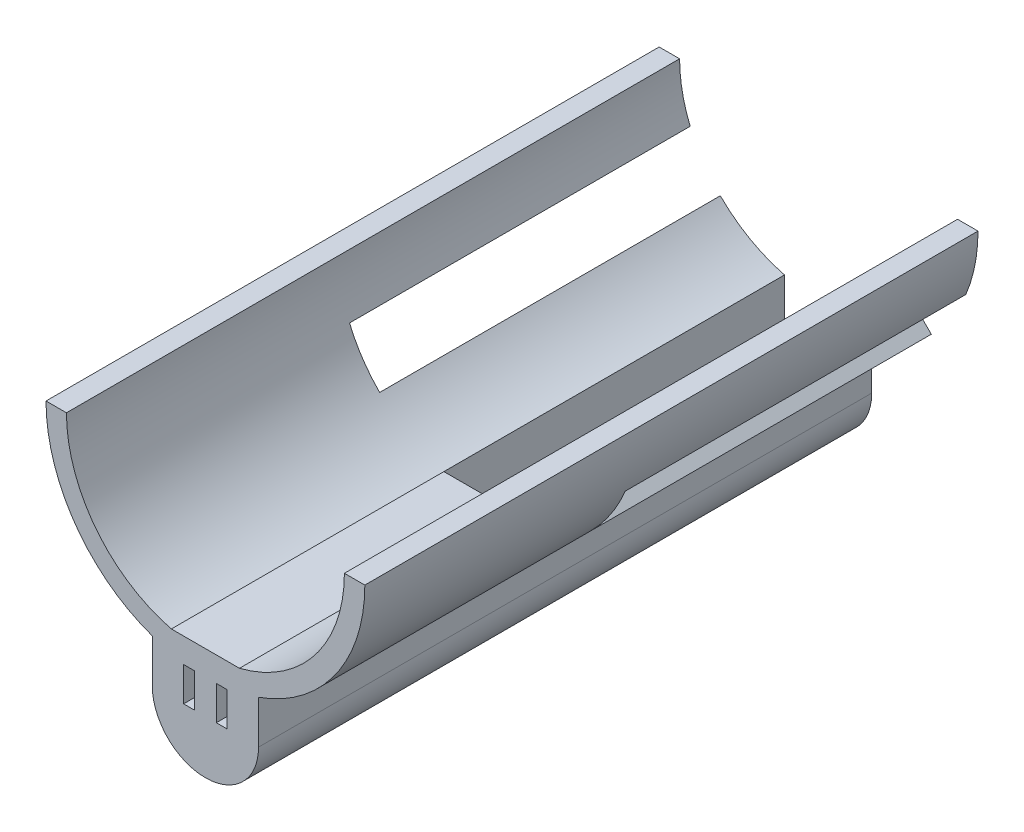
ISO-10303-21;
HEADER;
FILE_DESCRIPTION(('STEP AP214'),'2;1');
FILE_NAME('part.step','',(''),(''),'','','');
FILE_SCHEMA(('AUTOMOTIVE_DESIGN { 1 0 10303 214 1 1 1 1 }'));
ENDSEC;
DATA;
#1=APPLICATION_CONTEXT('core data for automotive mechanical design processes');
#2=APPLICATION_PROTOCOL_DEFINITION('international standard','automotive_design',2000,#1);
#3=PRODUCT_CONTEXT('',#1,'mechanical');
#4=PRODUCT('Part','Part','',(#3));
#5=PRODUCT_RELATED_PRODUCT_CATEGORY('part','',(#4));
#6=PRODUCT_DEFINITION_FORMATION('','',#4);
#7=PRODUCT_DEFINITION_CONTEXT('part definition',#1,'design');
#8=PRODUCT_DEFINITION('design','',#6,#7);
#9=PRODUCT_DEFINITION_SHAPE('','',#8);
#10=(LENGTH_UNIT() NAMED_UNIT(*) SI_UNIT(.MILLI.,.METRE.));
#11=(NAMED_UNIT(*) PLANE_ANGLE_UNIT() SI_UNIT($,.RADIAN.));
#12=(NAMED_UNIT(*) SI_UNIT($,.STERADIAN.) SOLID_ANGLE_UNIT());
#13=UNCERTAINTY_MEASURE_WITH_UNIT(LENGTH_MEASURE(1.E-05),#10,'distance_accuracy_value','');
#14=(GEOMETRIC_REPRESENTATION_CONTEXT(3) GLOBAL_UNCERTAINTY_ASSIGNED_CONTEXT((#13)) GLOBAL_UNIT_ASSIGNED_CONTEXT((#10,
#11,#12)) REPRESENTATION_CONTEXT('',''));
#15=CARTESIAN_POINT('',(0.,0.,0.));
#16=DIRECTION('',(0.,0.,1.));
#17=DIRECTION('',(1.,0.,0.));
#18=AXIS2_PLACEMENT_3D('',#15,#16,#17);
#19=CARTESIAN_POINT('',(5.00000000000001,0.,40.));
#20=DIRECTION('',(-1.,0.,0.));
#21=DIRECTION('',(0.,-1.,0.));
#22=AXIS2_PLACEMENT_3D('',#19,#20,#21);
#23=PLANE('',#22);
#24=DIRECTION('',(0.,-1.,0.));
#25=VECTOR('',#24,1.);
#26=CARTESIAN_POINT('',(5.00000000000001,0.,37.));
#27=LINE('',#26,#25);
#28=CARTESIAN_POINT('',(5.,-22.7777652933793,37.));
#29=VERTEX_POINT('',#28);
#30=CARTESIAN_POINT('',(5.,-28.4,37.));
#31=VERTEX_POINT('',#30);
#32=EDGE_CURVE('E306',#29,#31,#27,.T.);
#33=ORIENTED_EDGE('',*,*,#32,.F.);
#34=DIRECTION('',(0.,0.,1.));
#35=VECTOR('',#34,1.);
#36=CARTESIAN_POINT('',(5.,-22.7777652933793,0.));
#37=LINE('',#36,#35);
#38=CARTESIAN_POINT('',(5.,-22.7777652933793,0.));
#39=VERTEX_POINT('',#38);
#40=EDGE_CURVE('E65',#39,#29,#37,.T.);
#41=ORIENTED_EDGE('',*,*,#40,.F.);
#42=DIRECTION('',(0.,-1.,0.));
#43=VECTOR('',#42,1.);
#44=CARTESIAN_POINT('',(5.,-19.7777652933793,0.));
#45=LINE('',#44,#43);
#46=CARTESIAN_POINT('',(5.,-19.7777652933793,0.));
#47=VERTEX_POINT('',#46);
#48=EDGE_CURVE('E601',#47,#39,#45,.T.);
#49=ORIENTED_EDGE('',*,*,#48,.F.);
#50=DIRECTION('',(0.,0.,-1.));
#51=VECTOR('',#50,1.);
#52=CARTESIAN_POINT('',(5.,-19.7777652933793,40.));
#53=LINE('',#52,#51);
#54=CARTESIAN_POINT('',(5.,-19.7777652933793,-50.));
#55=VERTEX_POINT('',#54);
#56=EDGE_CURVE('E551',#47,#55,#53,.T.);
#57=ORIENTED_EDGE('',*,*,#56,.T.);
#58=DIRECTION('',(0.,1.,0.));
#59=VECTOR('',#58,1.);
#60=CARTESIAN_POINT('',(5.00000000000001,0.,-50.));
#61=LINE('',#60,#59);
#62=CARTESIAN_POINT('',(5.,-28.4,-50.));
#63=VERTEX_POINT('',#62);
#64=EDGE_CURVE('E428',#63,#55,#61,.T.);
#65=ORIENTED_EDGE('',*,*,#64,.F.);
#66=DIRECTION('',(0.,0.,-1.));
#67=VECTOR('',#66,1.);
#68=CARTESIAN_POINT('',(5.,-28.4,40.));
#69=LINE('',#68,#67);
#70=EDGE_CURVE('E548',#31,#63,#69,.T.);
#71=ORIENTED_EDGE('',*,*,#70,.F.);
#72=EDGE_LOOP('',(#33,#41,#49,#57,#65,#71));
#73=FACE_BOUND('',#72,.T.);
#74=ADVANCED_FACE('F49',(#73),#23,.T.);
#75=CARTESIAN_POINT('',(-5.,0.,40.));
#76=DIRECTION('',(-1.,0.,0.));
#77=DIRECTION('',(0.,-1.,0.));
#78=AXIS2_PLACEMENT_3D('',#75,#76,#77);
#79=PLANE('',#78);
#80=DIRECTION('',(0.,0.,1.));
#81=VECTOR('',#80,1.);
#82=CARTESIAN_POINT('',(-5.,-22.7777652933793,0.));
#83=LINE('',#82,#81);
#84=CARTESIAN_POINT('',(-5.,-22.7777652933793,0.));
#85=VERTEX_POINT('',#84);
#86=CARTESIAN_POINT('',(-5.,-22.7777652933793,37.));
#87=VERTEX_POINT('',#86);
#88=EDGE_CURVE('E617',#85,#87,#83,.T.);
#89=ORIENTED_EDGE('',*,*,#88,.T.);
#90=DIRECTION('',(0.,1.,0.));
#91=VECTOR('',#90,1.);
#92=CARTESIAN_POINT('',(-5.,0.,37.));
#93=LINE('',#92,#91);
#94=CARTESIAN_POINT('',(-5.,-28.4,37.));
#95=VERTEX_POINT('',#94);
#96=EDGE_CURVE('E299',#95,#87,#93,.T.);
#97=ORIENTED_EDGE('',*,*,#96,.F.);
#98=DIRECTION('',(0.,0.,-1.));
#99=VECTOR('',#98,1.);
#100=CARTESIAN_POINT('',(-5.,-28.4,40.));
#101=LINE('',#100,#99);
#102=CARTESIAN_POINT('',(-5.,-28.4,-50.));
#103=VERTEX_POINT('',#102);
#104=EDGE_CURVE('E545',#95,#103,#101,.T.);
#105=ORIENTED_EDGE('',*,*,#104,.T.);
#106=DIRECTION('',(0.,1.,0.));
#107=VECTOR('',#106,1.);
#108=CARTESIAN_POINT('',(-5.,0.,-50.));
#109=LINE('',#108,#107);
#110=CARTESIAN_POINT('',(-5.,-19.7777652933793,-50.));
#111=VERTEX_POINT('',#110);
#112=EDGE_CURVE('E437',#103,#111,#109,.T.);
#113=ORIENTED_EDGE('',*,*,#112,.T.);
#114=DIRECTION('',(0.,0.,-1.));
#115=VECTOR('',#114,1.);
#116=CARTESIAN_POINT('',(-5.,-19.7777652933793,40.));
#117=LINE('',#116,#115);
#118=CARTESIAN_POINT('',(-5.,-19.7777652933793,0.));
#119=VERTEX_POINT('',#118);
#120=EDGE_CURVE('E541',#119,#111,#117,.T.);
#121=ORIENTED_EDGE('',*,*,#120,.F.);
#122=DIRECTION('',(0.,1.,0.));
#123=VECTOR('',#122,1.);
#124=CARTESIAN_POINT('',(-5.,-19.7777652933793,0.));
#125=LINE('',#124,#123);
#126=EDGE_CURVE('E73',#85,#119,#125,.T.);
#127=ORIENTED_EDGE('',*,*,#126,.F.);
#128=EDGE_LOOP('',(#89,#97,#105,#113,#121,#127));
#129=FACE_BOUND('',#128,.T.);
#130=ADVANCED_FACE('F589',(#129),#79,.F.);
#131=CARTESIAN_POINT('',(0.,0.,37.));
#132=DIRECTION('',(0.,0.,1.));
#133=DIRECTION('',(1.,0.,0.));
#134=AXIS2_PLACEMENT_3D('',#131,#132,#133);
#135=PLANE('',#134);
#136=DIRECTION('',(-1.,0.,0.));
#137=VECTOR('',#136,1.);
#138=CARTESIAN_POINT('',(0.,-28.4,37.));
#139=LINE('',#138,#137);
#140=CARTESIAN_POINT('',(-1.6,-28.4,37.));
#141=VERTEX_POINT('',#140);
#142=CARTESIAN_POINT('',(-3.2,-28.4,37.));
#143=VERTEX_POINT('',#142);
#144=EDGE_CURVE('E309',#141,#143,#139,.T.);
#145=ORIENTED_EDGE('',*,*,#144,.F.);
#146=DIRECTION('',(0.,1.,0.));
#147=VECTOR('',#146,1.);
#148=CARTESIAN_POINT('',(-1.6,0.,37.));
#149=LINE('',#148,#147);
#150=CARTESIAN_POINT('',(-1.6,-23.4,37.));
#151=VERTEX_POINT('',#150);
#152=EDGE_CURVE('E279',#141,#151,#149,.T.);
#153=ORIENTED_EDGE('',*,*,#152,.T.);
#154=DIRECTION('',(-1.,0.,0.));
#155=VECTOR('',#154,1.);
#156=CARTESIAN_POINT('',(0.,-23.4,37.));
#157=LINE('',#156,#155);
#158=CARTESIAN_POINT('',(-3.2,-23.4,37.));
#159=VERTEX_POINT('',#158);
#160=EDGE_CURVE('E317',#151,#159,#157,.T.);
#161=ORIENTED_EDGE('',*,*,#160,.T.);
#162=DIRECTION('',(0.,1.,0.));
#163=VECTOR('',#162,1.);
#164=CARTESIAN_POINT('',(-3.2,0.,37.));
#165=LINE('',#164,#163);
#166=EDGE_CURVE('E313',#143,#159,#165,.T.);
#167=ORIENTED_EDGE('',*,*,#166,.F.);
#168=EDGE_LOOP('',(#145,#153,#161,#167));
#169=FACE_BOUND('',#168,.T.);
#170=DIRECTION('',(0.,1.,0.));
#171=VECTOR('',#170,1.);
#172=CARTESIAN_POINT('',(3.2,0.,37.));
#173=LINE('',#172,#171);
#174=CARTESIAN_POINT('',(3.2,-28.4,37.));
#175=VERTEX_POINT('',#174);
#176=CARTESIAN_POINT('',(3.2,-23.4,37.));
#177=VERTEX_POINT('',#176);
#178=EDGE_CURVE('E260',#175,#177,#173,.T.);
#179=ORIENTED_EDGE('',*,*,#178,.T.);
#180=DIRECTION('',(1.,0.,0.));
#181=VECTOR('',#180,1.);
#182=CARTESIAN_POINT('',(0.,-23.4,37.));
#183=LINE('',#182,#181);
#184=CARTESIAN_POINT('',(1.6,-23.4,37.));
#185=VERTEX_POINT('',#184);
#186=EDGE_CURVE('E296',#185,#177,#183,.T.);
#187=ORIENTED_EDGE('',*,*,#186,.F.);
#188=DIRECTION('',(0.,-1.,0.));
#189=VECTOR('',#188,1.);
#190=CARTESIAN_POINT('',(1.59999999999999,0.,37.));
#191=LINE('',#190,#189);
#192=CARTESIAN_POINT('',(1.6,-28.4,37.));
#193=VERTEX_POINT('',#192);
#194=EDGE_CURVE('E263',#185,#193,#191,.T.);
#195=ORIENTED_EDGE('',*,*,#194,.T.);
#196=DIRECTION('',(1.,0.,0.));
#197=VECTOR('',#196,1.);
#198=CARTESIAN_POINT('',(0.,-28.4,37.));
#199=LINE('',#198,#197);
#200=EDGE_CURVE('E254',#193,#175,#199,.T.);
#201=ORIENTED_EDGE('',*,*,#200,.T.);
#202=EDGE_LOOP('',(#179,#187,#195,#201));
#203=FACE_BOUND('',#202,.T.);
#204=DIRECTION('',(-1.,0.,0.));
#205=VECTOR('',#204,1.);
#206=CARTESIAN_POINT('',(5.,-22.7777652933793,37.));
#207=LINE('',#206,#205);
#208=EDGE_CURVE('E625',#29,#87,#207,.T.);
#209=ORIENTED_EDGE('',*,*,#208,.F.);
#210=ORIENTED_EDGE('',*,*,#32,.T.);
#211=CARTESIAN_POINT('',(0.,-28.4,37.));
#212=DIRECTION('',(0.,0.,1.));
#213=DIRECTION('',(1.,0.,0.));
#214=AXIS2_PLACEMENT_3D('',#211,#212,#213);
#215=CIRCLE('',#214,5.);
#216=EDGE_CURVE('E303',#31,#95,#215,.F.);
#217=ORIENTED_EDGE('',*,*,#216,.T.);
#218=ORIENTED_EDGE('',*,*,#96,.T.);
#219=EDGE_LOOP('',(#209,#210,#217,#218));
#220=FACE_BOUND('',#219,.T.);
#221=ADVANCED_FACE('F256',(#169,#203,#220),#135,.F.);
#222=CARTESIAN_POINT('',(0.,-28.4,40.));
#223=DIRECTION('',(0.,0.,-1.));
#224=DIRECTION('',(-1.,0.,0.));
#225=AXIS2_PLACEMENT_3D('',#222,#223,#224);
#226=CYLINDRICAL_SURFACE('',#225,5.);
#227=ORIENTED_EDGE('',*,*,#104,.F.);
#228=ORIENTED_EDGE('',*,*,#216,.F.);
#229=ORIENTED_EDGE('',*,*,#70,.T.);
#230=CARTESIAN_POINT('',(0.,-28.4,-50.));
#231=DIRECTION('',(0.,0.,1.));
#232=DIRECTION('',(1.,0.,0.));
#233=AXIS2_PLACEMENT_3D('',#230,#231,#232);
#234=CIRCLE('',#233,5.);
#235=EDGE_CURVE('E433',#103,#63,#234,.T.);
#236=ORIENTED_EDGE('',*,*,#235,.F.);
#237=EDGE_LOOP('',(#227,#228,#229,#236));
#238=FACE_BOUND('',#237,.T.);
#239=ADVANCED_FACE('F595',(#238),#226,.F.);
#240=CARTESIAN_POINT('',(0.,0.,0.));
#241=DIRECTION('',(0.,0.,1.));
#242=DIRECTION('',(1.,0.,0.));
#243=AXIS2_PLACEMENT_3D('',#240,#241,#242);
#244=PLANE('',#243);
#245=DIRECTION('',(-0.923879532511287,-0.38268343236509,0.));
#246=VECTOR('',#245,1.);
#247=CARTESIAN_POINT('',(4.14275551307149E-12,-1.00014965452531E-11,0.));
#248=LINE('',#247,#246);
#249=CARTESIAN_POINT('',(-18.8471424632261,-7.80674202025784,0.));
#250=VERTEX_POINT('',#249);
#251=CARTESIAN_POINT('',(-21.6187810607533,-8.95479231735034,0.));
#252=VERTEX_POINT('',#251);
#253=EDGE_CURVE('E375',#250,#252,#248,.T.);
#254=ORIENTED_EDGE('',*,*,#253,.F.);
#255=CARTESIAN_POINT('',(0.,0.,0.));
#256=DIRECTION('',(0.,0.,1.));
#257=DIRECTION('',(1.,0.,0.));
#258=AXIS2_PLACEMENT_3D('',#255,#256,#257);
#259=CIRCLE('',#258,20.4);
#260=CARTESIAN_POINT('',(-14.4249783361961,-14.424978336215,0.));
#261=VERTEX_POINT('',#260);
#262=EDGE_CURVE('E497',#250,#261,#259,.T.);
#263=ORIENTED_EDGE('',*,*,#262,.T.);
#264=DIRECTION('',(-0.707106781186548,-0.707106781186548,0.));
#265=VECTOR('',#264,1.);
#266=CARTESIAN_POINT('',(9.44386081203623E-12,-9.44386081203623E-12,0.));
#267=LINE('',#266,#265);
#268=CARTESIAN_POINT('',(-16.5462986797558,-16.5462986797747,0.));
#269=VERTEX_POINT('',#268);
#270=EDGE_CURVE('E352',#261,#269,#267,.T.);
#271=ORIENTED_EDGE('',*,*,#270,.T.);
#272=CARTESIAN_POINT('',(0.,0.,0.));
#273=DIRECTION('',(0.,0.,1.));
#274=DIRECTION('',(1.,0.,0.));
#275=AXIS2_PLACEMENT_3D('',#272,#273,#274);
#276=CIRCLE('',#275,23.4);
#277=EDGE_CURVE('E394',#252,#269,#276,.T.);
#278=ORIENTED_EDGE('',*,*,#277,.F.);
#279=EDGE_LOOP('',(#254,#263,#271,#278));
#280=FACE_BOUND('',#279,.T.);
#281=ADVANCED_FACE('F644',(#280),#244,.F.);
#282=CARTESIAN_POINT('',(0.,0.,0.));
#283=DIRECTION('',(0.,0.,1.));
#284=DIRECTION('',(1.,0.,0.));
#285=AXIS2_PLACEMENT_3D('',#282,#283,#284);
#286=CIRCLE('',#285,20.4);
#287=CARTESIAN_POINT('',(14.424978336215,-14.4249783361961,0.));
#288=VERTEX_POINT('',#287);
#289=CARTESIAN_POINT('',(18.8471424632411,-7.8067420202406,0.));
#290=VERTEX_POINT('',#289);
#291=EDGE_CURVE('E533',#288,#290,#286,.T.);
#292=ORIENTED_EDGE('',*,*,#291,.T.);
#293=DIRECTION('',(0.923879532511287,-0.38268343236509,0.));
#294=VECTOR('',#293,1.);
#295=CARTESIAN_POINT('',(4.14341936300548E-12,1.00030992207671E-11,0.));
#296=LINE('',#295,#294);
#297=CARTESIAN_POINT('',(21.6187810607682,-8.95479231733311,0.));
#298=VERTEX_POINT('',#297);
#299=EDGE_CURVE('E403',#290,#298,#296,.T.);
#300=ORIENTED_EDGE('',*,*,#299,.T.);
#301=CARTESIAN_POINT('',(0.,0.,0.));
#302=DIRECTION('',(0.,0.,1.));
#303=DIRECTION('',(1.,0.,0.));
#304=AXIS2_PLACEMENT_3D('',#301,#302,#303);
#305=CIRCLE('',#304,23.4);
#306=CARTESIAN_POINT('',(16.5462986797786,-16.5462986797597,0.));
#307=VERTEX_POINT('',#306);
#308=EDGE_CURVE('E529',#307,#298,#305,.T.);
#309=ORIENTED_EDGE('',*,*,#308,.F.);
#310=DIRECTION('',(0.707106781186547,-0.707106781186548,0.));
#311=VECTOR('',#310,1.);
#312=CARTESIAN_POINT('',(9.44999398570297E-12,9.44999398570297E-12,0.));
#313=LINE('',#312,#311);
#314=EDGE_CURVE('E429',#288,#307,#313,.T.);
#315=ORIENTED_EDGE('',*,*,#314,.F.);
#316=EDGE_LOOP('',(#292,#300,#309,#315));
#317=FACE_BOUND('',#316,.T.);
#318=ADVANCED_FACE('F679',(#317),#244,.F.);
#319=CARTESIAN_POINT('',(0.,-6.95263790962238E-12,40.));
#320=DIRECTION('',(0.,-1.,0.));
#321=DIRECTION('',(1.,0.,0.));
#322=AXIS2_PLACEMENT_3D('',#319,#320,#321);
#323=PLANE('',#322);
#324=DIRECTION('',(0.,0.,-1.));
#325=VECTOR('',#324,1.);
#326=CARTESIAN_POINT('',(-20.399999999993,-6.95638532882777E-12,40.));
#327=LINE('',#326,#325);
#328=CARTESIAN_POINT('',(-20.399999999993,-6.95638532882777E-12,40.));
#329=VERTEX_POINT('',#328);
#330=CARTESIAN_POINT('',(-20.399999999993,-6.95638532882777E-12,-50.));
#331=VERTEX_POINT('',#330);
#332=EDGE_CURVE('E525',#329,#331,#327,.T.);
#333=ORIENTED_EDGE('',*,*,#332,.T.);
#334=DIRECTION('',(-1.,0.,0.));
#335=VECTOR('',#334,1.);
#336=CARTESIAN_POINT('',(0.,-6.95263790962238E-12,-50.));
#337=LINE('',#336,#335);
#338=CARTESIAN_POINT('',(-23.399999999993,-6.95693641988739E-12,-50.));
#339=VERTEX_POINT('',#338);
#340=EDGE_CURVE('E370',#331,#339,#337,.T.);
#341=ORIENTED_EDGE('',*,*,#340,.T.);
#342=DIRECTION('',(0.,0.,-1.));
#343=VECTOR('',#342,1.);
#344=CARTESIAN_POINT('',(-23.399999999993,-6.95693641988739E-12,40.));
#345=LINE('',#344,#343);
#346=CARTESIAN_POINT('',(-23.399999999993,-6.95693641988739E-12,40.));
#347=VERTEX_POINT('',#346);
#348=EDGE_CURVE('E11',#347,#339,#345,.T.);
#349=ORIENTED_EDGE('',*,*,#348,.F.);
#350=DIRECTION('',(-1.,0.,0.));
#351=VECTOR('',#350,1.);
#352=CARTESIAN_POINT('',(0.,-6.95263790962238E-12,40.));
#353=LINE('',#352,#351);
#354=EDGE_CURVE('E492',#329,#347,#353,.T.);
#355=ORIENTED_EDGE('',*,*,#354,.F.);
#356=EDGE_LOOP('',(#333,#341,#349,#355));
#357=FACE_BOUND('',#356,.T.);
#358=ADVANCED_FACE('F51',(#357),#323,.F.);
#359=CARTESIAN_POINT('',(0.,0.,40.));
#360=DIRECTION('',(0.,0.,-1.));
#361=DIRECTION('',(-1.,0.,0.));
#362=AXIS2_PLACEMENT_3D('',#359,#360,#361);
#363=CYLINDRICAL_SURFACE('',#362,23.4);
#364=ORIENTED_EDGE('',*,*,#348,.T.);
#365=CARTESIAN_POINT('',(0.,0.,-50.));
#366=DIRECTION('',(0.,0.,1.));
#367=DIRECTION('',(1.,0.,0.));
#368=AXIS2_PLACEMENT_3D('',#365,#366,#367);
#369=CIRCLE('',#368,23.4);
#370=CARTESIAN_POINT('',(-21.6187810607533,-8.95479231735034,-50.));
#371=VERTEX_POINT('',#370);
#372=EDGE_CURVE('E374',#339,#371,#369,.T.);
#373=ORIENTED_EDGE('',*,*,#372,.T.);
#374=DIRECTION('',(0.,0.,1.));
#375=VECTOR('',#374,1.);
#376=CARTESIAN_POINT('',(-21.6187810607533,-8.95479231735034,-50.));
#377=LINE('',#376,#375);
#378=EDGE_CURVE('E385',#371,#252,#377,.T.);
#379=ORIENTED_EDGE('',*,*,#378,.T.);
#380=ORIENTED_EDGE('',*,*,#277,.T.);
#381=DIRECTION('',(0.,0.,1.));
#382=VECTOR('',#381,1.);
#383=CARTESIAN_POINT('',(-16.5462986797519,-16.5462986797707,-50.));
#384=LINE('',#383,#382);
#385=CARTESIAN_POINT('',(-16.5462986797519,-16.5462986797707,-50.));
#386=VERTEX_POINT('',#385);
#387=EDGE_CURVE('E485',#386,#269,#384,.T.);
#388=ORIENTED_EDGE('',*,*,#387,.F.);
#389=CARTESIAN_POINT('',(0.,0.,-50.));
#390=DIRECTION('',(0.,0.,1.));
#391=DIRECTION('',(1.,0.,0.));
#392=AXIS2_PLACEMENT_3D('',#389,#390,#391);
#393=CIRCLE('',#392,23.4);
#394=CARTESIAN_POINT('',(-7.8,-22.0617315730203,-50.));
#395=VERTEX_POINT('',#394);
#396=EDGE_CURVE('E449',#386,#395,#393,.T.);
#397=ORIENTED_EDGE('',*,*,#396,.T.);
#398=DIRECTION('',(0.,0.,-1.));
#399=VECTOR('',#398,1.);
#400=CARTESIAN_POINT('',(-7.8,-22.0617315730203,40.));
#401=LINE('',#400,#399);
#402=CARTESIAN_POINT('',(-7.8,-22.0617315730203,40.));
#403=VERTEX_POINT('',#402);
#404=EDGE_CURVE('E58',#403,#395,#401,.T.);
#405=ORIENTED_EDGE('',*,*,#404,.F.);
#406=CARTESIAN_POINT('',(0.,0.,40.));
#407=DIRECTION('',(0.,0.,1.));
#408=DIRECTION('',(1.,0.,0.));
#409=AXIS2_PLACEMENT_3D('',#406,#407,#408);
#410=CIRCLE('',#409,23.4);
#411=EDGE_CURVE('E496',#347,#403,#410,.T.);
#412=ORIENTED_EDGE('',*,*,#411,.F.);
#413=EDGE_LOOP('',(#364,#373,#379,#380,#388,#397,#405,#412));
#414=FACE_BOUND('',#413,.T.);
#415=ADVANCED_FACE('F582',(#414),#363,.T.);
#416=CARTESIAN_POINT('',(-7.80000000000001,0.,40.));
#417=DIRECTION('',(-1.,0.,0.));
#418=DIRECTION('',(0.,-1.,0.));
#419=AXIS2_PLACEMENT_3D('',#416,#417,#418);
#420=PLANE('',#419);
#421=ORIENTED_EDGE('',*,*,#404,.T.);
#422=DIRECTION('',(0.,1.,0.));
#423=VECTOR('',#422,1.);
#424=CARTESIAN_POINT('',(-7.80000000000001,0.,-50.));
#425=LINE('',#424,#423);
#426=CARTESIAN_POINT('',(-7.8,-28.4,-50.));
#427=VERTEX_POINT('',#426);
#428=EDGE_CURVE('E453',#427,#395,#425,.T.);
#429=ORIENTED_EDGE('',*,*,#428,.F.);
#430=DIRECTION('',(0.,0.,-1.));
#431=VECTOR('',#430,1.);
#432=CARTESIAN_POINT('',(-7.8,-28.4,40.));
#433=LINE('',#432,#431);
#434=CARTESIAN_POINT('',(-7.8,-28.4,40.));
#435=VERTEX_POINT('',#434);
#436=EDGE_CURVE('E567',#435,#427,#433,.T.);
#437=ORIENTED_EDGE('',*,*,#436,.F.);
#438=DIRECTION('',(0.,1.,0.));
#439=VECTOR('',#438,1.);
#440=CARTESIAN_POINT('',(-7.80000000000001,0.,40.));
#441=LINE('',#440,#439);
#442=EDGE_CURVE('E500',#435,#403,#441,.T.);
#443=ORIENTED_EDGE('',*,*,#442,.T.);
#444=EDGE_LOOP('',(#421,#429,#437,#443));
#445=FACE_BOUND('',#444,.T.);
#446=ADVANCED_FACE('F573',(#445),#420,.T.);
#447=CARTESIAN_POINT('',(0.,-28.4,40.));
#448=DIRECTION('',(0.,0.,-1.));
#449=DIRECTION('',(-1.,0.,0.));
#450=AXIS2_PLACEMENT_3D('',#447,#448,#449);
#451=CYLINDRICAL_SURFACE('',#450,7.8);
#452=ORIENTED_EDGE('',*,*,#436,.T.);
#453=CARTESIAN_POINT('',(0.,-28.4,-50.));
#454=DIRECTION('',(0.,0.,1.));
#455=DIRECTION('',(1.,0.,0.));
#456=AXIS2_PLACEMENT_3D('',#453,#454,#455);
#457=CIRCLE('',#456,7.8);
#458=CARTESIAN_POINT('',(7.8,-28.4,-50.));
#459=VERTEX_POINT('',#458);
#460=EDGE_CURVE('E457',#427,#459,#457,.T.);
#461=ORIENTED_EDGE('',*,*,#460,.T.);
#462=DIRECTION('',(0.,0.,-1.));
#463=VECTOR('',#462,1.);
#464=CARTESIAN_POINT('',(7.8,-28.4,40.));
#465=LINE('',#464,#463);
#466=CARTESIAN_POINT('',(7.8,-28.4,40.));
#467=VERTEX_POINT('',#466);
#468=EDGE_CURVE('E564',#467,#459,#465,.T.);
#469=ORIENTED_EDGE('',*,*,#468,.F.);
#470=CARTESIAN_POINT('',(0.,-28.4,40.));
#471=DIRECTION('',(0.,0.,1.));
#472=DIRECTION('',(1.,0.,0.));
#473=AXIS2_PLACEMENT_3D('',#470,#471,#472);
#474=CIRCLE('',#473,7.8);
#475=EDGE_CURVE('E504',#435,#467,#474,.T.);
#476=ORIENTED_EDGE('',*,*,#475,.F.);
#477=EDGE_LOOP('',(#452,#461,#469,#476));
#478=FACE_BOUND('',#477,.T.);
#479=ADVANCED_FACE('F669',(#478),#451,.T.);
#480=CARTESIAN_POINT('',(7.80000000000001,0.,40.));
#481=DIRECTION('',(-1.,0.,0.));
#482=DIRECTION('',(0.,-1.,0.));
#483=AXIS2_PLACEMENT_3D('',#480,#481,#482);
#484=PLANE('',#483);
#485=ORIENTED_EDGE('',*,*,#468,.T.);
#486=DIRECTION('',(0.,1.,0.));
#487=VECTOR('',#486,1.);
#488=CARTESIAN_POINT('',(7.80000000000001,0.,-50.));
#489=LINE('',#488,#487);
#490=CARTESIAN_POINT('',(7.8,-22.0617315730203,-50.));
#491=VERTEX_POINT('',#490);
#492=EDGE_CURVE('E461',#459,#491,#489,.T.);
#493=ORIENTED_EDGE('',*,*,#492,.T.);
#494=DIRECTION('',(0.,0.,-1.));
#495=VECTOR('',#494,1.);
#496=CARTESIAN_POINT('',(7.8,-22.0617315730203,40.));
#497=LINE('',#496,#495);
#498=CARTESIAN_POINT('',(7.8,-22.0617315730203,40.));
#499=VERTEX_POINT('',#498);
#500=EDGE_CURVE('E561',#499,#491,#497,.T.);
#501=ORIENTED_EDGE('',*,*,#500,.F.);
#502=DIRECTION('',(0.,1.,0.));
#503=VECTOR('',#502,1.);
#504=CARTESIAN_POINT('',(7.80000000000001,0.,40.));
#505=LINE('',#504,#503);
#506=EDGE_CURVE('E507',#467,#499,#505,.T.);
#507=ORIENTED_EDGE('',*,*,#506,.F.);
#508=EDGE_LOOP('',(#485,#493,#501,#507));
#509=FACE_BOUND('',#508,.T.);
#510=ADVANCED_FACE('F665',(#509),#484,.F.);
#511=CARTESIAN_POINT('',(0.,0.,40.));
#512=DIRECTION('',(0.,0.,-1.));
#513=DIRECTION('',(-1.,0.,0.));
#514=AXIS2_PLACEMENT_3D('',#511,#512,#513);
#515=CYLINDRICAL_SURFACE('',#514,23.4);
#516=ORIENTED_EDGE('',*,*,#500,.T.);
#517=CARTESIAN_POINT('',(0.,0.,-50.));
#518=DIRECTION('',(0.,0.,1.));
#519=DIRECTION('',(1.,0.,0.));
#520=AXIS2_PLACEMENT_3D('',#517,#518,#519);
#521=CIRCLE('',#520,23.4);
#522=CARTESIAN_POINT('',(16.5462986797786,-16.5462986797597,-50.));
#523=VERTEX_POINT('',#522);
#524=EDGE_CURVE('E465',#491,#523,#521,.T.);
#525=ORIENTED_EDGE('',*,*,#524,.T.);
#526=DIRECTION('',(0.,0.,1.));
#527=VECTOR('',#526,1.);
#528=CARTESIAN_POINT('',(16.5462986797786,-16.5462986797597,-50.));
#529=LINE('',#528,#527);
#530=EDGE_CURVE('E481',#523,#307,#529,.T.);
#531=ORIENTED_EDGE('',*,*,#530,.T.);
#532=ORIENTED_EDGE('',*,*,#308,.T.);
#533=DIRECTION('',(0.,0.,1.));
#534=VECTOR('',#533,1.);
#535=CARTESIAN_POINT('',(21.6187810607749,-8.95479231733587,-50.));
#536=LINE('',#535,#534);
#537=CARTESIAN_POINT('',(21.6187810607749,-8.95479231733587,-50.));
#538=VERTEX_POINT('',#537);
#539=EDGE_CURVE('E415',#538,#298,#536,.T.);
#540=ORIENTED_EDGE('',*,*,#539,.F.);
#541=CARTESIAN_POINT('',(0.,0.,-50.));
#542=DIRECTION('',(0.,0.,1.));
#543=DIRECTION('',(1.,0.,0.));
#544=AXIS2_PLACEMENT_3D('',#541,#542,#543);
#545=CIRCLE('',#544,23.4);
#546=CARTESIAN_POINT('',(23.400000000007,6.95407074637738E-12,-50.));
#547=VERTEX_POINT('',#546);
#548=EDGE_CURVE('E402',#538,#547,#545,.T.);
#549=ORIENTED_EDGE('',*,*,#548,.T.);
#550=DIRECTION('',(0.,0.,-1.));
#551=VECTOR('',#550,1.);
#552=CARTESIAN_POINT('',(23.400000000007,6.95407074637738E-12,40.));
#553=LINE('',#552,#551);
#554=CARTESIAN_POINT('',(23.400000000007,6.95407074637738E-12,40.));
#555=VERTEX_POINT('',#554);
#556=EDGE_CURVE('E558',#555,#547,#553,.T.);
#557=ORIENTED_EDGE('',*,*,#556,.F.);
#558=CARTESIAN_POINT('',(0.,0.,40.));
#559=DIRECTION('',(0.,0.,1.));
#560=DIRECTION('',(1.,0.,0.));
#561=AXIS2_PLACEMENT_3D('',#558,#559,#560);
#562=CIRCLE('',#561,23.4);
#563=EDGE_CURVE('E510',#499,#555,#562,.T.);
#564=ORIENTED_EDGE('',*,*,#563,.F.);
#565=EDGE_LOOP('',(#516,#525,#531,#532,#540,#549,#557,#564));
#566=FACE_BOUND('',#565,.T.);
#567=ADVANCED_FACE('F661',(#566),#515,.T.);
#568=CARTESIAN_POINT('',(0.,6.95263790962238E-12,40.));
#569=DIRECTION('',(0.,1.,0.));
#570=DIRECTION('',(-1.,0.,0.));
#571=AXIS2_PLACEMENT_3D('',#568,#569,#570);
#572=PLANE('',#571);
#573=ORIENTED_EDGE('',*,*,#556,.T.);
#574=DIRECTION('',(1.,0.,0.));
#575=VECTOR('',#574,1.);
#576=CARTESIAN_POINT('',(0.,6.95263790962238E-12,-50.));
#577=LINE('',#576,#575);
#578=CARTESIAN_POINT('',(20.400000000007,6.95388704935751E-12,-50.));
#579=VERTEX_POINT('',#578);
#580=EDGE_CURVE('E407',#579,#547,#577,.T.);
#581=ORIENTED_EDGE('',*,*,#580,.F.);
#582=DIRECTION('',(0.,0.,-1.));
#583=VECTOR('',#582,1.);
#584=CARTESIAN_POINT('',(20.400000000007,6.95388704935751E-12,40.));
#585=LINE('',#584,#583);
#586=CARTESIAN_POINT('',(20.400000000007,6.95388704935751E-12,40.));
#587=VERTEX_POINT('',#586);
#588=EDGE_CURVE('E555',#587,#579,#585,.T.);
#589=ORIENTED_EDGE('',*,*,#588,.F.);
#590=DIRECTION('',(1.,0.,0.));
#591=VECTOR('',#590,1.);
#592=CARTESIAN_POINT('',(0.,6.95263790962238E-12,40.));
#593=LINE('',#592,#591);
#594=EDGE_CURVE('E513',#587,#555,#593,.T.);
#595=ORIENTED_EDGE('',*,*,#594,.T.);
#596=EDGE_LOOP('',(#573,#581,#589,#595));
#597=FACE_BOUND('',#596,.T.);
#598=ADVANCED_FACE('F658',(#597),#572,.T.);
#599=CARTESIAN_POINT('',(0.,0.,40.));
#600=DIRECTION('',(0.,0.,-1.));
#601=DIRECTION('',(-1.,0.,0.));
#602=AXIS2_PLACEMENT_3D('',#599,#600,#601);
#603=CYLINDRICAL_SURFACE('',#602,20.4);
#604=ORIENTED_EDGE('',*,*,#291,.F.);
#605=DIRECTION('',(0.,0.,1.));
#606=VECTOR('',#605,1.);
#607=CARTESIAN_POINT('',(14.4249783362189,-14.4249783362,-50.));
#608=LINE('',#607,#606);
#609=CARTESIAN_POINT('',(14.4249783362189,-14.4249783362,-50.));
#610=VERTEX_POINT('',#609);
#611=EDGE_CURVE('E419',#610,#288,#608,.T.);
#612=ORIENTED_EDGE('',*,*,#611,.F.);
#613=CARTESIAN_POINT('',(0.,0.,-50.));
#614=DIRECTION('',(0.,0.,1.));
#615=DIRECTION('',(1.,0.,0.));
#616=AXIS2_PLACEMENT_3D('',#613,#614,#615);
#617=CIRCLE('',#616,20.4);
#618=EDGE_CURVE('E424',#55,#610,#617,.T.);
#619=ORIENTED_EDGE('',*,*,#618,.F.);
#620=ORIENTED_EDGE('',*,*,#56,.F.);
#621=CARTESIAN_POINT('',(5.,-19.7777652933793,40.));
#622=VERTEX_POINT('',#621);
#623=EDGE_CURVE('E552',#622,#47,#53,.T.);
#624=ORIENTED_EDGE('',*,*,#623,.F.);
#625=CARTESIAN_POINT('',(0.,0.,40.));
#626=DIRECTION('',(0.,0.,1.));
#627=DIRECTION('',(1.,0.,0.));
#628=AXIS2_PLACEMENT_3D('',#625,#626,#627);
#629=CIRCLE('',#628,20.4);
#630=EDGE_CURVE('E517',#622,#587,#629,.T.);
#631=ORIENTED_EDGE('',*,*,#630,.T.);
#632=ORIENTED_EDGE('',*,*,#588,.T.);
#633=CARTESIAN_POINT('',(0.,0.,-50.));
#634=DIRECTION('',(0.,0.,1.));
#635=DIRECTION('',(1.,0.,0.));
#636=AXIS2_PLACEMENT_3D('',#633,#634,#635);
#637=CIRCLE('',#636,20.4);
#638=CARTESIAN_POINT('',(18.8471424632411,-7.8067420202406,-50.));
#639=VERTEX_POINT('',#638);
#640=EDGE_CURVE('E411',#639,#579,#637,.T.);
#641=ORIENTED_EDGE('',*,*,#640,.F.);
#642=DIRECTION('',(0.,0.,1.));
#643=VECTOR('',#642,1.);
#644=CARTESIAN_POINT('',(18.8471424632411,-7.8067420202406,-50.));
#645=LINE('',#644,#643);
#646=EDGE_CURVE('E389',#639,#290,#645,.T.);
#647=ORIENTED_EDGE('',*,*,#646,.T.);
#648=EDGE_LOOP('',(#604,#612,#619,#620,#624,#631,#632,#641,#647));
#649=FACE_BOUND('',#648,.T.);
#650=ADVANCED_FACE('F656',(#649),#603,.F.);
#651=CARTESIAN_POINT('',(0.,0.,40.));
#652=DIRECTION('',(0.,0.,-1.));
#653=DIRECTION('',(-1.,0.,0.));
#654=AXIS2_PLACEMENT_3D('',#651,#652,#653);
#655=CYLINDRICAL_SURFACE('',#654,20.4);
#656=ORIENTED_EDGE('',*,*,#262,.F.);
#657=DIRECTION('',(0.,0.,1.));
#658=VECTOR('',#657,1.);
#659=CARTESIAN_POINT('',(-18.8471424632194,-7.80674202025507,-50.));
#660=LINE('',#659,#658);
#661=CARTESIAN_POINT('',(-18.8471424632194,-7.80674202025507,-50.));
#662=VERTEX_POINT('',#661);
#663=EDGE_CURVE('E390',#662,#250,#660,.T.);
#664=ORIENTED_EDGE('',*,*,#663,.F.);
#665=CARTESIAN_POINT('',(0.,0.,-50.));
#666=DIRECTION('',(0.,0.,1.));
#667=DIRECTION('',(1.,0.,0.));
#668=AXIS2_PLACEMENT_3D('',#665,#666,#667);
#669=CIRCLE('',#668,20.4);
#670=EDGE_CURVE('E382',#331,#662,#669,.T.);
#671=ORIENTED_EDGE('',*,*,#670,.F.);
#672=ORIENTED_EDGE('',*,*,#332,.F.);
#673=CARTESIAN_POINT('',(0.,0.,40.));
#674=DIRECTION('',(0.,0.,1.));
#675=DIRECTION('',(1.,0.,0.));
#676=AXIS2_PLACEMENT_3D('',#673,#674,#675);
#677=CIRCLE('',#676,20.4);
#678=CARTESIAN_POINT('',(-5.,-19.7777652933793,40.));
#679=VERTEX_POINT('',#678);
#680=EDGE_CURVE('E521',#329,#679,#677,.T.);
#681=ORIENTED_EDGE('',*,*,#680,.T.);
#682=EDGE_CURVE('E542',#679,#119,#117,.T.);
#683=ORIENTED_EDGE('',*,*,#682,.T.);
#684=ORIENTED_EDGE('',*,*,#120,.T.);
#685=CARTESIAN_POINT('',(0.,0.,-50.));
#686=DIRECTION('',(0.,0.,1.));
#687=DIRECTION('',(1.,0.,0.));
#688=AXIS2_PLACEMENT_3D('',#685,#686,#687);
#689=CIRCLE('',#688,20.4);
#690=CARTESIAN_POINT('',(-14.4249783361922,-14.4249783362111,-50.));
#691=VERTEX_POINT('',#690);
#692=EDGE_CURVE('E441',#691,#111,#689,.T.);
#693=ORIENTED_EDGE('',*,*,#692,.F.);
#694=DIRECTION('',(0.,0.,1.));
#695=VECTOR('',#694,1.);
#696=CARTESIAN_POINT('',(-14.4249783361922,-14.4249783362111,-50.));
#697=LINE('',#696,#695);
#698=EDGE_CURVE('E472',#691,#261,#697,.T.);
#699=ORIENTED_EDGE('',*,*,#698,.T.);
#700=EDGE_LOOP('',(#656,#664,#671,#672,#681,#683,#684,#693,#699));
#701=FACE_BOUND('',#700,.T.);
#702=ADVANCED_FACE('F608',(#701),#655,.F.);
#703=CARTESIAN_POINT('',(0.,0.,40.));
#704=DIRECTION('',(0.,0.,1.));
#705=DIRECTION('',(1.,0.,0.));
#706=AXIS2_PLACEMENT_3D('',#703,#704,#705);
#707=PLANE('',#706);
#708=ORIENTED_EDGE('',*,*,#630,.F.);
#709=DIRECTION('',(1.,0.,0.));
#710=VECTOR('',#709,1.);
#711=CARTESIAN_POINT('',(0.,-19.7777652933793,40.));
#712=LINE('',#711,#710);
#713=EDGE_CURVE('E335',#679,#622,#712,.T.);
#714=ORIENTED_EDGE('',*,*,#713,.F.);
#715=ORIENTED_EDGE('',*,*,#680,.F.);
#716=ORIENTED_EDGE('',*,*,#354,.T.);
#717=ORIENTED_EDGE('',*,*,#411,.T.);
#718=ORIENTED_EDGE('',*,*,#442,.F.);
#719=ORIENTED_EDGE('',*,*,#475,.T.);
#720=ORIENTED_EDGE('',*,*,#506,.T.);
#721=ORIENTED_EDGE('',*,*,#563,.T.);
#722=ORIENTED_EDGE('',*,*,#594,.F.);
#723=EDGE_LOOP('',(#708,#714,#715,#716,#717,#718,#719,#720,#721,#722));
#724=FACE_BOUND('',#723,.T.);
#725=DIRECTION('',(0.,1.,0.));
#726=VECTOR('',#725,1.);
#727=CARTESIAN_POINT('',(3.2,0.,40.));
#728=LINE('',#727,#726);
#729=CARTESIAN_POINT('',(3.2,-28.4,40.));
#730=VERTEX_POINT('',#729);
#731=CARTESIAN_POINT('',(3.2,-23.4,40.));
#732=VERTEX_POINT('',#731);
#733=EDGE_CURVE('E323',#730,#732,#728,.T.);
#734=ORIENTED_EDGE('',*,*,#733,.F.);
#735=DIRECTION('',(1.,0.,0.));
#736=VECTOR('',#735,1.);
#737=CARTESIAN_POINT('',(0.,-28.4,40.));
#738=LINE('',#737,#736);
#739=CARTESIAN_POINT('',(1.6,-28.4,40.));
#740=VERTEX_POINT('',#739);
#741=EDGE_CURVE('E273',#740,#730,#738,.T.);
#742=ORIENTED_EDGE('',*,*,#741,.F.);
#743=DIRECTION('',(0.,-1.,0.));
#744=VECTOR('',#743,1.);
#745=CARTESIAN_POINT('',(1.59999999999999,0.,40.));
#746=LINE('',#745,#744);
#747=CARTESIAN_POINT('',(1.6,-23.4,40.));
#748=VERTEX_POINT('',#747);
#749=EDGE_CURVE('E328',#748,#740,#746,.T.);
#750=ORIENTED_EDGE('',*,*,#749,.F.);
#751=DIRECTION('',(1.,0.,0.));
#752=VECTOR('',#751,1.);
#753=CARTESIAN_POINT('',(0.,-23.4,40.));
#754=LINE('',#753,#752);
#755=EDGE_CURVE('E331',#748,#732,#754,.T.);
#756=ORIENTED_EDGE('',*,*,#755,.T.);
#757=EDGE_LOOP('',(#734,#742,#750,#756));
#758=FACE_BOUND('',#757,.T.);
#759=DIRECTION('',(-1.,0.,0.));
#760=VECTOR('',#759,1.);
#761=CARTESIAN_POINT('',(0.,-28.4,40.));
#762=LINE('',#761,#760);
#763=CARTESIAN_POINT('',(-1.6,-28.4,40.));
#764=VERTEX_POINT('',#763);
#765=CARTESIAN_POINT('',(-3.2,-28.4,40.));
#766=VERTEX_POINT('',#765);
#767=EDGE_CURVE('E338',#764,#766,#762,.T.);
#768=ORIENTED_EDGE('',*,*,#767,.T.);
#769=DIRECTION('',(0.,1.,0.));
#770=VECTOR('',#769,1.);
#771=CARTESIAN_POINT('',(-3.2,0.,40.));
#772=LINE('',#771,#770);
#773=CARTESIAN_POINT('',(-3.2,-23.4,40.));
#774=VERTEX_POINT('',#773);
#775=EDGE_CURVE('E342',#766,#774,#772,.T.);
#776=ORIENTED_EDGE('',*,*,#775,.T.);
#777=DIRECTION('',(-1.,0.,0.));
#778=VECTOR('',#777,1.);
#779=CARTESIAN_POINT('',(0.,-23.4,40.));
#780=LINE('',#779,#778);
#781=CARTESIAN_POINT('',(-1.6,-23.4,40.));
#782=VERTEX_POINT('',#781);
#783=EDGE_CURVE('E289',#782,#774,#780,.T.);
#784=ORIENTED_EDGE('',*,*,#783,.F.);
#785=DIRECTION('',(0.,1.,0.));
#786=VECTOR('',#785,1.);
#787=CARTESIAN_POINT('',(-1.6,0.,40.));
#788=LINE('',#787,#786);
#789=EDGE_CURVE('E285',#764,#782,#788,.T.);
#790=ORIENTED_EDGE('',*,*,#789,.F.);
#791=EDGE_LOOP('',(#768,#776,#784,#790));
#792=FACE_BOUND('',#791,.T.);
#793=ADVANCED_FACE('F698',(#724,#758,#792),#707,.T.);
#794=CARTESIAN_POINT('',(9.44999398570297E-12,9.44999398570297E-12,-50.));
#795=DIRECTION('',(-0.707106781186548,-0.707106781186547,0.));
#796=DIRECTION('',(0.707106781186547,-0.707106781186548,0.));
#797=AXIS2_PLACEMENT_3D('',#794,#795,#796);
#798=PLANE('',#797);
#799=ORIENTED_EDGE('',*,*,#314,.T.);
#800=ORIENTED_EDGE('',*,*,#530,.F.);
#801=DIRECTION('',(0.707106781186547,-0.707106781186548,0.));
#802=VECTOR('',#801,1.);
#803=CARTESIAN_POINT('',(9.44999398570297E-12,9.44999398570297E-12,-50.));
#804=LINE('',#803,#802);
#805=EDGE_CURVE('E469',#610,#523,#804,.T.);
#806=ORIENTED_EDGE('',*,*,#805,.F.);
#807=ORIENTED_EDGE('',*,*,#611,.T.);
#808=EDGE_LOOP('',(#799,#800,#806,#807));
#809=FACE_BOUND('',#808,.T.);
#810=ADVANCED_FACE('F715',(#809),#798,.F.);
#811=CARTESIAN_POINT('',(9.44386081203623E-12,-9.44386081203623E-12,-50.));
#812=DIRECTION('',(-0.707106781186548,0.707106781186548,0.));
#813=DIRECTION('',(-0.707106781186548,-0.707106781186548,0.));
#814=AXIS2_PLACEMENT_3D('',#811,#812,#813);
#815=PLANE('',#814);
#816=ORIENTED_EDGE('',*,*,#270,.F.);
#817=ORIENTED_EDGE('',*,*,#698,.F.);
#818=DIRECTION('',(-0.707106781186548,-0.707106781186548,0.));
#819=VECTOR('',#818,1.);
#820=CARTESIAN_POINT('',(9.44386081203623E-12,-9.44386081203623E-12,-50.));
#821=LINE('',#820,#819);
#822=EDGE_CURVE('E445',#691,#386,#821,.T.);
#823=ORIENTED_EDGE('',*,*,#822,.T.);
#824=ORIENTED_EDGE('',*,*,#387,.T.);
#825=EDGE_LOOP('',(#816,#817,#823,#824));
#826=FACE_BOUND('',#825,.T.);
#827=ADVANCED_FACE('F585',(#826),#815,.T.);
#828=CARTESIAN_POINT('',(0.,0.,-50.));
#829=DIRECTION('',(0.,0.,1.));
#830=DIRECTION('',(1.,0.,0.));
#831=AXIS2_PLACEMENT_3D('',#828,#829,#830);
#832=PLANE('',#831);
#833=ORIENTED_EDGE('',*,*,#618,.T.);
#834=ORIENTED_EDGE('',*,*,#805,.T.);
#835=ORIENTED_EDGE('',*,*,#524,.F.);
#836=ORIENTED_EDGE('',*,*,#492,.F.);
#837=ORIENTED_EDGE('',*,*,#460,.F.);
#838=ORIENTED_EDGE('',*,*,#428,.T.);
#839=ORIENTED_EDGE('',*,*,#396,.F.);
#840=ORIENTED_EDGE('',*,*,#822,.F.);
#841=ORIENTED_EDGE('',*,*,#692,.T.);
#842=ORIENTED_EDGE('',*,*,#112,.F.);
#843=ORIENTED_EDGE('',*,*,#235,.T.);
#844=ORIENTED_EDGE('',*,*,#64,.T.);
#845=EDGE_LOOP('',(#833,#834,#835,#836,#837,#838,#839,#840,#841,#842,#843,#844));
#846=FACE_BOUND('',#845,.T.);
#847=ADVANCED_FACE('F579',(#846),#832,.F.);
#848=CARTESIAN_POINT('',(4.14341936300548E-12,1.00030992207671E-11,-50.));
#849=DIRECTION('',(-0.38268343236509,-0.923879532511287,0.));
#850=DIRECTION('',(0.923879532511287,-0.38268343236509,0.));
#851=AXIS2_PLACEMENT_3D('',#848,#849,#850);
#852=PLANE('',#851);
#853=ORIENTED_EDGE('',*,*,#299,.F.);
#854=ORIENTED_EDGE('',*,*,#646,.F.);
#855=DIRECTION('',(0.923879532511287,-0.38268343236509,0.));
#856=VECTOR('',#855,1.);
#857=CARTESIAN_POINT('',(4.14341936300548E-12,1.00030992207671E-11,-50.));
#858=LINE('',#857,#856);
#859=EDGE_CURVE('E398',#639,#538,#858,.T.);
#860=ORIENTED_EDGE('',*,*,#859,.T.);
#861=ORIENTED_EDGE('',*,*,#539,.T.);
#862=EDGE_LOOP('',(#853,#854,#860,#861));
#863=FACE_BOUND('',#862,.T.);
#864=ADVANCED_FACE('F712',(#863),#852,.T.);
#865=CARTESIAN_POINT('',(0.,0.,-50.));
#866=DIRECTION('',(0.,0.,1.));
#867=DIRECTION('',(1.,0.,0.));
#868=AXIS2_PLACEMENT_3D('',#865,#866,#867);
#869=PLANE('',#868);
#870=ORIENTED_EDGE('',*,*,#859,.F.);
#871=ORIENTED_EDGE('',*,*,#640,.T.);
#872=ORIENTED_EDGE('',*,*,#580,.T.);
#873=ORIENTED_EDGE('',*,*,#548,.F.);
#874=EDGE_LOOP('',(#870,#871,#872,#873));
#875=FACE_BOUND('',#874,.T.);
#876=ADVANCED_FACE('F706',(#875),#869,.F.);
#877=CARTESIAN_POINT('',(4.14275551307149E-12,-1.00014965452531E-11,-50.));
#878=DIRECTION('',(-0.38268343236509,0.923879532511287,0.));
#879=DIRECTION('',(-0.923879532511287,-0.38268343236509,0.));
#880=AXIS2_PLACEMENT_3D('',#877,#878,#879);
#881=PLANE('',#880);
#882=ORIENTED_EDGE('',*,*,#253,.T.);
#883=ORIENTED_EDGE('',*,*,#378,.F.);
#884=DIRECTION('',(-0.923879532511287,-0.38268343236509,0.));
#885=VECTOR('',#884,1.);
#886=CARTESIAN_POINT('',(4.14275551307149E-12,-1.00014965452531E-11,-50.));
#887=LINE('',#886,#885);
#888=EDGE_CURVE('E379',#662,#371,#887,.T.);
#889=ORIENTED_EDGE('',*,*,#888,.F.);
#890=ORIENTED_EDGE('',*,*,#663,.T.);
#891=EDGE_LOOP('',(#882,#883,#889,#890));
#892=FACE_BOUND('',#891,.T.);
#893=ADVANCED_FACE('F865',(#892),#881,.F.);
#894=CARTESIAN_POINT('',(0.,0.,-50.));
#895=DIRECTION('',(0.,0.,1.));
#896=DIRECTION('',(1.,0.,0.));
#897=AXIS2_PLACEMENT_3D('',#894,#895,#896);
#898=PLANE('',#897);
#899=ORIENTED_EDGE('',*,*,#340,.F.);
#900=ORIENTED_EDGE('',*,*,#670,.T.);
#901=ORIENTED_EDGE('',*,*,#888,.T.);
#902=ORIENTED_EDGE('',*,*,#372,.F.);
#903=EDGE_LOOP('',(#899,#900,#901,#902));
#904=FACE_BOUND('',#903,.T.);
#905=ADVANCED_FACE('F694',(#904),#898,.F.);
#906=CARTESIAN_POINT('',(0.,-28.4,37.));
#907=DIRECTION('',(0.,1.,0.));
#908=DIRECTION('',(0.,0.,1.));
#909=AXIS2_PLACEMENT_3D('',#906,#907,#908);
#910=PLANE('',#909);
#911=ORIENTED_EDGE('',*,*,#767,.F.);
#912=DIRECTION('',(0.,0.,1.));
#913=VECTOR('',#912,1.);
#914=CARTESIAN_POINT('',(-1.6,-28.4,37.));
#915=LINE('',#914,#913);
#916=EDGE_CURVE('E349',#141,#764,#915,.T.);
#917=ORIENTED_EDGE('',*,*,#916,.F.);
#918=ORIENTED_EDGE('',*,*,#144,.T.);
#919=DIRECTION('',(0.,0.,1.));
#920=VECTOR('',#919,1.);
#921=CARTESIAN_POINT('',(-3.2,-28.4,37.));
#922=LINE('',#921,#920);
#923=EDGE_CURVE('E360',#143,#766,#922,.T.);
#924=ORIENTED_EDGE('',*,*,#923,.T.);
#925=EDGE_LOOP('',(#911,#917,#918,#924));
#926=FACE_BOUND('',#925,.T.);
#927=ADVANCED_FACE('F841',(#926),#910,.T.);
#928=CARTESIAN_POINT('',(-1.6,0.,37.));
#929=DIRECTION('',(1.,0.,0.));
#930=DIRECTION('',(0.,0.,-1.));
#931=AXIS2_PLACEMENT_3D('',#928,#929,#930);
#932=PLANE('',#931);
#933=ORIENTED_EDGE('',*,*,#789,.T.);
#934=DIRECTION('',(0.,0.,1.));
#935=VECTOR('',#934,1.);
#936=CARTESIAN_POINT('',(-1.6,-23.4,37.));
#937=LINE('',#936,#935);
#938=EDGE_CURVE('E353',#151,#782,#937,.T.);
#939=ORIENTED_EDGE('',*,*,#938,.F.);
#940=ORIENTED_EDGE('',*,*,#152,.F.);
#941=ORIENTED_EDGE('',*,*,#916,.T.);
#942=EDGE_LOOP('',(#933,#939,#940,#941));
#943=FACE_BOUND('',#942,.T.);
#944=ADVANCED_FACE('F831',(#943),#932,.F.);
#945=CARTESIAN_POINT('',(0.,-23.4,37.));
#946=DIRECTION('',(0.,1.,0.));
#947=DIRECTION('',(0.,0.,1.));
#948=AXIS2_PLACEMENT_3D('',#945,#946,#947);
#949=PLANE('',#948);
#950=ORIENTED_EDGE('',*,*,#783,.T.);
#951=DIRECTION('',(0.,0.,1.));
#952=VECTOR('',#951,1.);
#953=CARTESIAN_POINT('',(-3.2,-23.4,37.));
#954=LINE('',#953,#952);
#955=EDGE_CURVE('E357',#159,#774,#954,.T.);
#956=ORIENTED_EDGE('',*,*,#955,.F.);
#957=ORIENTED_EDGE('',*,*,#160,.F.);
#958=ORIENTED_EDGE('',*,*,#938,.T.);
#959=EDGE_LOOP('',(#950,#956,#957,#958));
#960=FACE_BOUND('',#959,.T.);
#961=ADVANCED_FACE('F747',(#960),#949,.F.);
#962=CARTESIAN_POINT('',(0.,-19.7777652933793,37.));
#963=DIRECTION('',(0.,-1.,0.));
#964=DIRECTION('',(0.,0.,-1.));
#965=AXIS2_PLACEMENT_3D('',#962,#963,#964);
#966=PLANE('',#965);
#967=ORIENTED_EDGE('',*,*,#713,.T.);
#968=ORIENTED_EDGE('',*,*,#623,.T.);
#969=DIRECTION('',(1.,0.,0.));
#970=VECTOR('',#969,1.);
#971=CARTESIAN_POINT('',(5.,-19.7777652933793,0.));
#972=LINE('',#971,#970);
#973=EDGE_CURVE('E614',#119,#47,#972,.T.);
#974=ORIENTED_EDGE('',*,*,#973,.F.);
#975=ORIENTED_EDGE('',*,*,#682,.F.);
#976=EDGE_LOOP('',(#967,#968,#974,#975));
#977=FACE_BOUND('',#976,.T.);
#978=ADVANCED_FACE('F613',(#977),#966,.F.);
#979=CARTESIAN_POINT('',(3.2,0.,37.));
#980=DIRECTION('',(1.,0.,0.));
#981=DIRECTION('',(0.,0.,-1.));
#982=AXIS2_PLACEMENT_3D('',#979,#980,#981);
#983=PLANE('',#982);
#984=ORIENTED_EDGE('',*,*,#733,.T.);
#985=DIRECTION('',(0.,0.,1.));
#986=VECTOR('',#985,1.);
#987=CARTESIAN_POINT('',(3.2,-23.4,37.));
#988=LINE('',#987,#986);
#989=EDGE_CURVE('E282',#177,#732,#988,.T.);
#990=ORIENTED_EDGE('',*,*,#989,.F.);
#991=ORIENTED_EDGE('',*,*,#178,.F.);
#992=DIRECTION('',(0.,0.,1.));
#993=VECTOR('',#992,1.);
#994=CARTESIAN_POINT('',(3.2,-28.4,37.));
#995=LINE('',#994,#993);
#996=EDGE_CURVE('E270',#175,#730,#995,.T.);
#997=ORIENTED_EDGE('',*,*,#996,.T.);
#998=EDGE_LOOP('',(#984,#990,#991,#997));
#999=FACE_BOUND('',#998,.T.);
#1000=ADVANCED_FACE('F281',(#999),#983,.F.);
#1001=CARTESIAN_POINT('',(0.,-23.4,37.));
#1002=DIRECTION('',(0.,-1.,0.));
#1003=DIRECTION('',(0.,0.,-1.));
#1004=AXIS2_PLACEMENT_3D('',#1001,#1002,#1003);
#1005=PLANE('',#1004);
#1006=ORIENTED_EDGE('',*,*,#755,.F.);
#1007=DIRECTION('',(0.,0.,1.));
#1008=VECTOR('',#1007,1.);
#1009=CARTESIAN_POINT('',(1.6,-23.4,37.));
#1010=LINE('',#1009,#1008);
#1011=EDGE_CURVE('E365',#185,#748,#1010,.T.);
#1012=ORIENTED_EDGE('',*,*,#1011,.F.);
#1013=ORIENTED_EDGE('',*,*,#186,.T.);
#1014=ORIENTED_EDGE('',*,*,#989,.T.);
#1015=EDGE_LOOP('',(#1006,#1012,#1013,#1014));
#1016=FACE_BOUND('',#1015,.T.);
#1017=ADVANCED_FACE('F803',(#1016),#1005,.T.);
#1018=CARTESIAN_POINT('',(1.59999999999999,0.,37.));
#1019=DIRECTION('',(-1.,0.,0.));
#1020=DIRECTION('',(0.,-1.,0.));
#1021=AXIS2_PLACEMENT_3D('',#1018,#1019,#1020);
#1022=PLANE('',#1021);
#1023=ORIENTED_EDGE('',*,*,#749,.T.);
#1024=DIRECTION('',(0.,0.,1.));
#1025=VECTOR('',#1024,1.);
#1026=CARTESIAN_POINT('',(1.6,-28.4,37.));
#1027=LINE('',#1026,#1025);
#1028=EDGE_CURVE('E278',#193,#740,#1027,.T.);
#1029=ORIENTED_EDGE('',*,*,#1028,.F.);
#1030=ORIENTED_EDGE('',*,*,#194,.F.);
#1031=ORIENTED_EDGE('',*,*,#1011,.T.);
#1032=EDGE_LOOP('',(#1023,#1029,#1030,#1031));
#1033=FACE_BOUND('',#1032,.T.);
#1034=ADVANCED_FACE('F794',(#1033),#1022,.F.);
#1035=CARTESIAN_POINT('',(0.,-28.4,37.));
#1036=DIRECTION('',(0.,-1.,0.));
#1037=DIRECTION('',(0.,0.,-1.));
#1038=AXIS2_PLACEMENT_3D('',#1035,#1036,#1037);
#1039=PLANE('',#1038);
#1040=ORIENTED_EDGE('',*,*,#741,.T.);
#1041=ORIENTED_EDGE('',*,*,#996,.F.);
#1042=ORIENTED_EDGE('',*,*,#200,.F.);
#1043=ORIENTED_EDGE('',*,*,#1028,.T.);
#1044=EDGE_LOOP('',(#1040,#1041,#1042,#1043));
#1045=FACE_BOUND('',#1044,.T.);
#1046=ADVANCED_FACE('F271',(#1045),#1039,.F.);
#1047=CARTESIAN_POINT('',(-3.2,0.,37.));
#1048=DIRECTION('',(1.,0.,0.));
#1049=DIRECTION('',(0.,0.,-1.));
#1050=AXIS2_PLACEMENT_3D('',#1047,#1048,#1049);
#1051=PLANE('',#1050);
#1052=ORIENTED_EDGE('',*,*,#775,.F.);
#1053=ORIENTED_EDGE('',*,*,#923,.F.);
#1054=ORIENTED_EDGE('',*,*,#166,.T.);
#1055=ORIENTED_EDGE('',*,*,#955,.T.);
#1056=EDGE_LOOP('',(#1052,#1053,#1054,#1055));
#1057=FACE_BOUND('',#1056,.T.);
#1058=ADVANCED_FACE('F755',(#1057),#1051,.T.);
#1059=CARTESIAN_POINT('',(5.,-22.7777652933793,0.));
#1060=DIRECTION('',(0.,1.,0.));
#1061=DIRECTION('',(0.,0.,1.));
#1062=AXIS2_PLACEMENT_3D('',#1059,#1060,#1061);
#1063=PLANE('',#1062);
#1064=ORIENTED_EDGE('',*,*,#208,.T.);
#1065=ORIENTED_EDGE('',*,*,#88,.F.);
#1066=DIRECTION('',(-1.,0.,0.));
#1067=VECTOR('',#1066,1.);
#1068=CARTESIAN_POINT('',(5.,-22.7777652933793,0.));
#1069=LINE('',#1068,#1067);
#1070=EDGE_CURVE('E621',#39,#85,#1069,.T.);
#1071=ORIENTED_EDGE('',*,*,#1070,.F.);
#1072=ORIENTED_EDGE('',*,*,#40,.T.);
#1073=EDGE_LOOP('',(#1064,#1065,#1071,#1072));
#1074=FACE_BOUND('',#1073,.T.);
#1075=ADVANCED_FACE('F634',(#1074),#1063,.F.);
#1076=CARTESIAN_POINT('',(0.,0.,0.));
#1077=DIRECTION('',(0.,0.,-1.));
#1078=DIRECTION('',(-1.,0.,0.));
#1079=AXIS2_PLACEMENT_3D('',#1076,#1077,#1078);
#1080=PLANE('',#1079);
#1081=ORIENTED_EDGE('',*,*,#48,.T.);
#1082=ORIENTED_EDGE('',*,*,#1070,.T.);
#1083=ORIENTED_EDGE('',*,*,#126,.T.);
#1084=ORIENTED_EDGE('',*,*,#973,.T.);
#1085=EDGE_LOOP('',(#1081,#1082,#1083,#1084));
#1086=FACE_BOUND('',#1085,.T.);
#1087=ADVANCED_FACE('F633',(#1086),#1080,.T.);
#1088=CLOSED_SHELL('',(#74,#130,#221,#239,#281,#318,#358,#415,#446,#479,#510,#567,#598,#650,
#702,#793,#810,#827,#847,#864,#876,#893,#905,#927,#944,#961,#978,#1000,#1017,#1034,#1046,#1058,
#1075,#1087));
#1089=MANIFOLD_SOLID_BREP('B2',#1088);
#1090=ADVANCED_BREP_SHAPE_REPRESENTATION('',(#18,#1089),#14);
#1091=SHAPE_DEFINITION_REPRESENTATION(#9,#1090);
ENDSEC;
END-ISO-10303-21;
